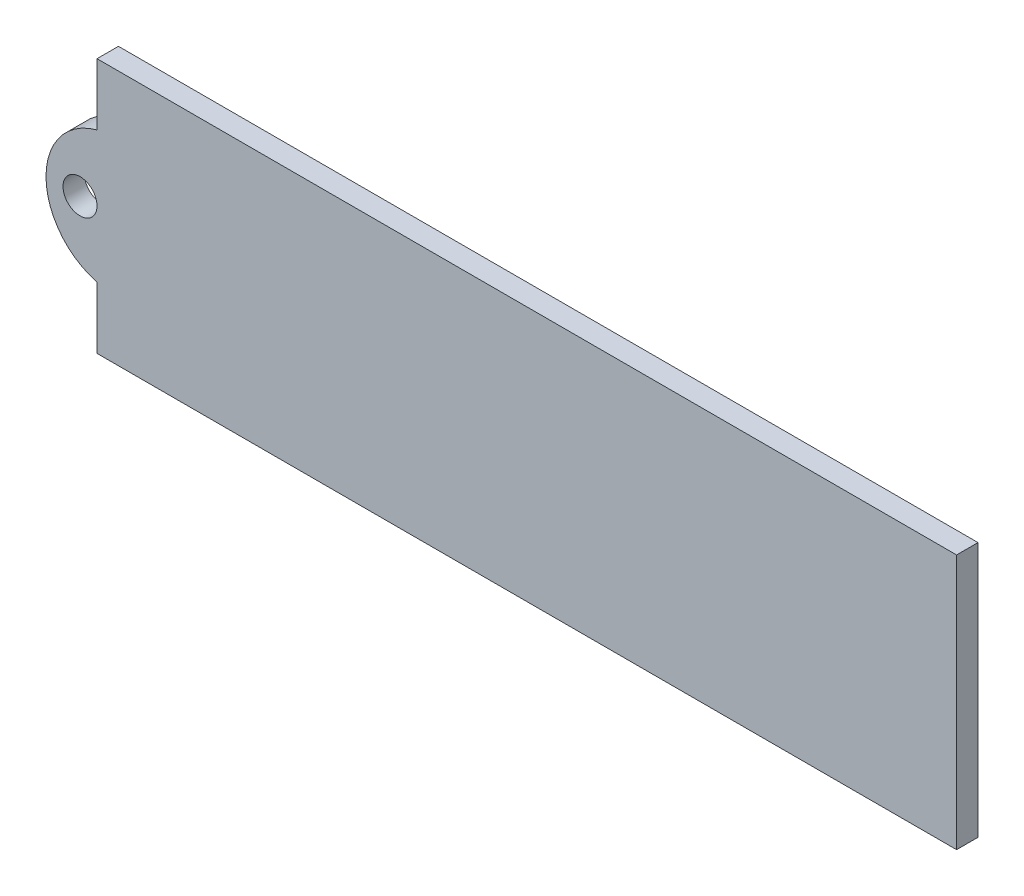
ISO-10303-21;
HEADER;
FILE_DESCRIPTION(('STEP AP214'),'2;1');
FILE_NAME('part.step','',(''),(''),'','','');
FILE_SCHEMA(('AUTOMOTIVE_DESIGN { 1 0 10303 214 1 1 1 1 }'));
ENDSEC;
DATA;
#1=APPLICATION_CONTEXT('core data for automotive mechanical design processes');
#2=APPLICATION_PROTOCOL_DEFINITION('international standard','automotive_design',2000,#1);
#3=PRODUCT_CONTEXT('',#1,'mechanical');
#4=PRODUCT('Part','Part','',(#3));
#5=PRODUCT_RELATED_PRODUCT_CATEGORY('part','',(#4));
#6=PRODUCT_DEFINITION_FORMATION('','',#4);
#7=PRODUCT_DEFINITION_CONTEXT('part definition',#1,'design');
#8=PRODUCT_DEFINITION('design','',#6,#7);
#9=PRODUCT_DEFINITION_SHAPE('','',#8);
#10=(LENGTH_UNIT() NAMED_UNIT(*) SI_UNIT(.MILLI.,.METRE.));
#11=(NAMED_UNIT(*) PLANE_ANGLE_UNIT() SI_UNIT($,.RADIAN.));
#12=(NAMED_UNIT(*) SI_UNIT($,.STERADIAN.) SOLID_ANGLE_UNIT());
#13=UNCERTAINTY_MEASURE_WITH_UNIT(LENGTH_MEASURE(1.E-05),#10,'distance_accuracy_value','');
#14=(GEOMETRIC_REPRESENTATION_CONTEXT(3) GLOBAL_UNCERTAINTY_ASSIGNED_CONTEXT((#13)) GLOBAL_UNIT_ASSIGNED_CONTEXT((#10,
#11,#12)) REPRESENTATION_CONTEXT('',''));
#15=CARTESIAN_POINT('',(0.,0.,0.));
#16=DIRECTION('',(0.,0.,1.));
#17=DIRECTION('',(1.,0.,0.));
#18=AXIS2_PLACEMENT_3D('',#15,#16,#17);
#19=CARTESIAN_POINT('',(-40.11295,0.,2.));
#20=DIRECTION('',(1.,0.,0.));
#21=DIRECTION('',(0.,0.,-1.));
#22=AXIS2_PLACEMENT_3D('',#19,#20,#21);
#23=PLANE('',#22);
#24=DIRECTION('',(0.,-1.,0.));
#25=VECTOR('',#24,1.);
#26=CARTESIAN_POINT('',(-40.11295,0.,0.));
#27=LINE('',#26,#25);
#28=CARTESIAN_POINT('',(-40.11295,11.9126,0.));
#29=VERTEX_POINT('',#28);
#30=CARTESIAN_POINT('',(-40.11295,6.14836106210428,0.));
#31=VERTEX_POINT('',#30);
#32=EDGE_CURVE('E132',#29,#31,#27,.T.);
#33=ORIENTED_EDGE('',*,*,#32,.T.);
#34=DIRECTION('',(0.,0.,-1.));
#35=VECTOR('',#34,1.);
#36=CARTESIAN_POINT('',(-40.11295,6.14836106210428,2.));
#37=LINE('',#36,#35);
#38=CARTESIAN_POINT('',(-40.11295,6.14836106210428,2.));
#39=VERTEX_POINT('',#38);
#40=EDGE_CURVE('E11',#39,#31,#37,.T.);
#41=ORIENTED_EDGE('',*,*,#40,.F.);
#42=DIRECTION('',(0.,-1.,0.));
#43=VECTOR('',#42,1.);
#44=CARTESIAN_POINT('',(-40.11295,0.,2.));
#45=LINE('',#44,#43);
#46=CARTESIAN_POINT('',(-40.11295,11.9126,2.));
#47=VERTEX_POINT('',#46);
#48=EDGE_CURVE('E146',#47,#39,#45,.T.);
#49=ORIENTED_EDGE('',*,*,#48,.F.);
#50=DIRECTION('',(0.,0.,-1.));
#51=VECTOR('',#50,1.);
#52=CARTESIAN_POINT('',(-40.11295,11.9126,2.));
#53=LINE('',#52,#51);
#54=EDGE_CURVE('E62',#47,#29,#53,.T.);
#55=ORIENTED_EDGE('',*,*,#54,.T.);
#56=EDGE_LOOP('',(#33,#41,#49,#55));
#57=FACE_BOUND('',#56,.T.);
#58=ADVANCED_FACE('F45',(#57),#23,.F.);
#59=CARTESIAN_POINT('',(-38.52545,0.,2.));
#60=DIRECTION('',(0.,0.,-1.));
#61=DIRECTION('',(-1.,0.,0.));
#62=AXIS2_PLACEMENT_3D('',#59,#60,#61);
#63=CYLINDRICAL_SURFACE('',#62,6.35);
#64=CARTESIAN_POINT('',(-38.52545,0.,0.));
#65=DIRECTION('',(0.,0.,1.));
#66=DIRECTION('',(1.,0.,0.));
#67=AXIS2_PLACEMENT_3D('',#64,#65,#66);
#68=CIRCLE('',#67,6.35);
#69=CARTESIAN_POINT('',(-40.11295,-6.14836106210428,0.));
#70=VERTEX_POINT('',#69);
#71=EDGE_CURVE('E134',#31,#70,#68,.T.);
#72=ORIENTED_EDGE('',*,*,#71,.T.);
#73=DIRECTION('',(0.,0.,-1.));
#74=VECTOR('',#73,1.);
#75=CARTESIAN_POINT('',(-40.11295,-6.14836106210428,2.));
#76=LINE('',#75,#74);
#77=CARTESIAN_POINT('',(-40.11295,-6.14836106210428,2.));
#78=VERTEX_POINT('',#77);
#79=EDGE_CURVE('E54',#78,#70,#76,.T.);
#80=ORIENTED_EDGE('',*,*,#79,.F.);
#81=CARTESIAN_POINT('',(-38.52545,0.,2.));
#82=DIRECTION('',(0.,0.,1.));
#83=DIRECTION('',(1.,0.,0.));
#84=AXIS2_PLACEMENT_3D('',#81,#82,#83);
#85=CIRCLE('',#84,6.35);
#86=EDGE_CURVE('E94',#39,#78,#85,.T.);
#87=ORIENTED_EDGE('',*,*,#86,.F.);
#88=ORIENTED_EDGE('',*,*,#40,.T.);
#89=EDGE_LOOP('',(#72,#80,#87,#88));
#90=FACE_BOUND('',#89,.T.);
#91=ADVANCED_FACE('F47',(#90),#63,.T.);
#92=CARTESIAN_POINT('',(-40.11295,-11.9126,0.));
#93=VERTEX_POINT('',#92);
#94=EDGE_CURVE('E136',#70,#93,#27,.T.);
#95=ORIENTED_EDGE('',*,*,#94,.T.);
#96=DIRECTION('',(0.,0.,-1.));
#97=VECTOR('',#96,1.);
#98=CARTESIAN_POINT('',(-40.11295,-11.9126,2.));
#99=LINE('',#98,#97);
#100=CARTESIAN_POINT('',(-40.11295,-11.9126,2.));
#101=VERTEX_POINT('',#100);
#102=EDGE_CURVE('E113',#101,#93,#99,.T.);
#103=ORIENTED_EDGE('',*,*,#102,.F.);
#104=EDGE_CURVE('E121',#78,#101,#45,.T.);
#105=ORIENTED_EDGE('',*,*,#104,.F.);
#106=ORIENTED_EDGE('',*,*,#79,.T.);
#107=EDGE_LOOP('',(#95,#103,#105,#106));
#108=FACE_BOUND('',#107,.T.);
#109=ADVANCED_FACE('F153',(#108),#23,.F.);
#110=CARTESIAN_POINT('',(0.,-11.9126,2.));
#111=DIRECTION('',(0.,-1.,0.));
#112=DIRECTION('',(0.,0.,-1.));
#113=AXIS2_PLACEMENT_3D('',#110,#111,#112);
#114=PLANE('',#113);
#115=DIRECTION('',(-1.,0.,0.));
#116=VECTOR('',#115,1.);
#117=CARTESIAN_POINT('',(0.,-11.9126,0.));
#118=LINE('',#117,#116);
#119=CARTESIAN_POINT('',(40.11295,-11.9126,0.));
#120=VERTEX_POINT('',#119);
#121=EDGE_CURVE('E109',#120,#93,#118,.T.);
#122=ORIENTED_EDGE('',*,*,#121,.F.);
#123=DIRECTION('',(0.,0.,-1.));
#124=VECTOR('',#123,1.);
#125=CARTESIAN_POINT('',(40.11295,-11.9126,2.));
#126=LINE('',#125,#124);
#127=CARTESIAN_POINT('',(40.11295,-11.9126,2.));
#128=VERTEX_POINT('',#127);
#129=EDGE_CURVE('E104',#128,#120,#126,.T.);
#130=ORIENTED_EDGE('',*,*,#129,.F.);
#131=DIRECTION('',(-1.,0.,0.));
#132=VECTOR('',#131,1.);
#133=CARTESIAN_POINT('',(0.,-11.9126,2.));
#134=LINE('',#133,#132);
#135=EDGE_CURVE('E107',#128,#101,#134,.T.);
#136=ORIENTED_EDGE('',*,*,#135,.T.);
#137=ORIENTED_EDGE('',*,*,#102,.T.);
#138=EDGE_LOOP('',(#122,#130,#136,#137));
#139=FACE_BOUND('',#138,.T.);
#140=ADVANCED_FACE('F106',(#139),#114,.T.);
#141=CARTESIAN_POINT('',(40.11295,0.,2.));
#142=DIRECTION('',(1.,0.,0.));
#143=DIRECTION('',(0.,0.,-1.));
#144=AXIS2_PLACEMENT_3D('',#141,#142,#143);
#145=PLANE('',#144);
#146=DIRECTION('',(0.,-1.,0.));
#147=VECTOR('',#146,1.);
#148=CARTESIAN_POINT('',(40.11295,0.,0.));
#149=LINE('',#148,#147);
#150=CARTESIAN_POINT('',(40.11295,11.9126,0.));
#151=VERTEX_POINT('',#150);
#152=EDGE_CURVE('E140',#151,#120,#149,.T.);
#153=ORIENTED_EDGE('',*,*,#152,.F.);
#154=DIRECTION('',(0.,0.,-1.));
#155=VECTOR('',#154,1.);
#156=CARTESIAN_POINT('',(40.11295,11.9126,2.));
#157=LINE('',#156,#155);
#158=CARTESIAN_POINT('',(40.11295,11.9126,2.));
#159=VERTEX_POINT('',#158);
#160=EDGE_CURVE('E82',#159,#151,#157,.T.);
#161=ORIENTED_EDGE('',*,*,#160,.F.);
#162=DIRECTION('',(0.,-1.,0.));
#163=VECTOR('',#162,1.);
#164=CARTESIAN_POINT('',(40.11295,0.,2.));
#165=LINE('',#164,#163);
#166=EDGE_CURVE('E119',#159,#128,#165,.T.);
#167=ORIENTED_EDGE('',*,*,#166,.T.);
#168=ORIENTED_EDGE('',*,*,#129,.T.);
#169=EDGE_LOOP('',(#153,#161,#167,#168));
#170=FACE_BOUND('',#169,.T.);
#171=ADVANCED_FACE('F125',(#170),#145,.T.);
#172=CARTESIAN_POINT('',(0.,11.9126,2.));
#173=DIRECTION('',(0.,1.,0.));
#174=DIRECTION('',(0.,0.,1.));
#175=AXIS2_PLACEMENT_3D('',#172,#173,#174);
#176=PLANE('',#175);
#177=DIRECTION('',(1.,0.,0.));
#178=VECTOR('',#177,1.);
#179=CARTESIAN_POINT('',(0.,11.9126,0.));
#180=LINE('',#179,#178);
#181=EDGE_CURVE('E142',#29,#151,#180,.T.);
#182=ORIENTED_EDGE('',*,*,#181,.F.);
#183=ORIENTED_EDGE('',*,*,#54,.F.);
#184=DIRECTION('',(1.,0.,0.));
#185=VECTOR('',#184,1.);
#186=CARTESIAN_POINT('',(0.,11.9126,2.));
#187=LINE('',#186,#185);
#188=EDGE_CURVE('E126',#47,#159,#187,.T.);
#189=ORIENTED_EDGE('',*,*,#188,.T.);
#190=ORIENTED_EDGE('',*,*,#160,.T.);
#191=EDGE_LOOP('',(#182,#183,#189,#190));
#192=FACE_BOUND('',#191,.T.);
#193=ADVANCED_FACE('F156',(#192),#176,.T.);
#194=CARTESIAN_POINT('',(0.,0.,2.));
#195=DIRECTION('',(0.,0.,1.));
#196=DIRECTION('',(1.,0.,0.));
#197=AXIS2_PLACEMENT_3D('',#194,#195,#196);
#198=PLANE('',#197);
#199=CARTESIAN_POINT('',(-41.7004500000002,1.11022302462516E-13,2.));
#200=DIRECTION('',(0.,0.,1.));
#201=DIRECTION('',(1.,0.,0.));
#202=AXIS2_PLACEMENT_3D('',#199,#200,#201);
#203=CIRCLE('',#202,1.58750000000001);
#204=CARTESIAN_POINT('',(-40.1129500000002,1.11022302462516E-13,2.));
#205=VERTEX_POINT('',#204);
#206=EDGE_CURVE('E135',#205,#205,#203,.T.);
#207=ORIENTED_EDGE('',*,*,#206,.F.);
#208=EDGE_LOOP('',(#207));
#209=FACE_BOUND('',#208,.T.);
#210=ORIENTED_EDGE('',*,*,#48,.T.);
#211=ORIENTED_EDGE('',*,*,#86,.T.);
#212=ORIENTED_EDGE('',*,*,#104,.T.);
#213=ORIENTED_EDGE('',*,*,#135,.F.);
#214=ORIENTED_EDGE('',*,*,#166,.F.);
#215=ORIENTED_EDGE('',*,*,#188,.F.);
#216=EDGE_LOOP('',(#210,#211,#212,#213,#214,#215));
#217=FACE_BOUND('',#216,.T.);
#218=ADVANCED_FACE('F117',(#209,#217),#198,.T.);
#219=CARTESIAN_POINT('',(0.,0.,0.));
#220=DIRECTION('',(0.,0.,1.));
#221=DIRECTION('',(1.,0.,0.));
#222=AXIS2_PLACEMENT_3D('',#219,#220,#221);
#223=PLANE('',#222);
#224=CARTESIAN_POINT('',(-41.7004500000002,1.11022302462516E-13,0.));
#225=DIRECTION('',(0.,0.,-1.));
#226=DIRECTION('',(-1.,0.,0.));
#227=AXIS2_PLACEMENT_3D('',#224,#225,#226);
#228=CIRCLE('',#227,1.58750000000001);
#229=CARTESIAN_POINT('',(-43.2879500000002,1.11022302462516E-13,0.));
#230=VERTEX_POINT('',#229);
#231=EDGE_CURVE('E215',#230,#230,#228,.T.);
#232=ORIENTED_EDGE('',*,*,#231,.F.);
#233=EDGE_LOOP('',(#232));
#234=FACE_BOUND('',#233,.T.);
#235=ORIENTED_EDGE('',*,*,#32,.F.);
#236=ORIENTED_EDGE('',*,*,#181,.T.);
#237=ORIENTED_EDGE('',*,*,#152,.T.);
#238=ORIENTED_EDGE('',*,*,#121,.T.);
#239=ORIENTED_EDGE('',*,*,#94,.F.);
#240=ORIENTED_EDGE('',*,*,#71,.F.);
#241=EDGE_LOOP('',(#235,#236,#237,#238,#239,#240));
#242=FACE_BOUND('',#241,.T.);
#243=ADVANCED_FACE('F155',(#234,#242),#223,.F.);
#244=CARTESIAN_POINT('',(-41.7004500000002,1.11022302462516E-13,2.54));
#245=DIRECTION('',(0.,0.,-1.));
#246=DIRECTION('',(-1.,0.,0.));
#247=AXIS2_PLACEMENT_3D('',#244,#245,#246);
#248=CYLINDRICAL_SURFACE('',#247,1.58750000000001);
#249=ORIENTED_EDGE('',*,*,#206,.T.);
#250=EDGE_LOOP('',(#249));
#251=FACE_BOUND('',#250,.T.);
#252=ORIENTED_EDGE('',*,*,#231,.T.);
#253=EDGE_LOOP('',(#252));
#254=FACE_BOUND('',#253,.T.);
#255=ADVANCED_FACE('F182',(#251,#254),#248,.F.);
#256=CLOSED_SHELL('',(#58,#91,#109,#140,#171,#193,#218,#243,#255));
#257=MANIFOLD_SOLID_BREP('B2',#256);
#258=ADVANCED_BREP_SHAPE_REPRESENTATION('',(#18,#257),#14);
#259=SHAPE_DEFINITION_REPRESENTATION(#9,#258);
ENDSEC;
END-ISO-10303-21;
